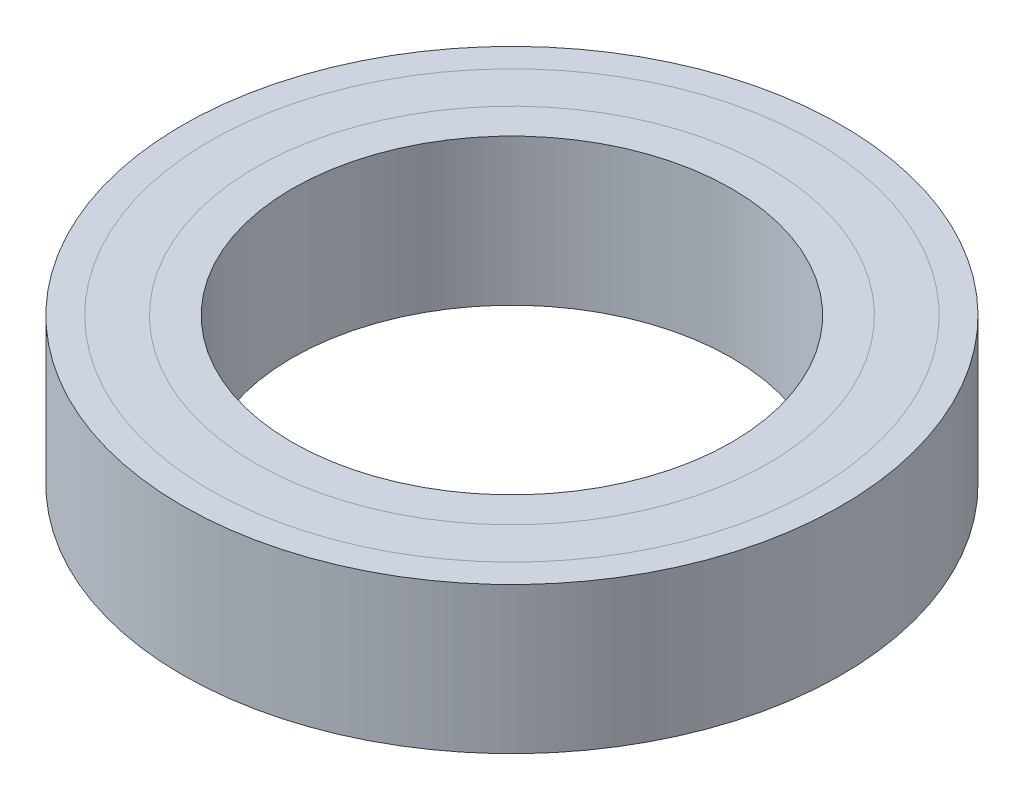
ISO-10303-21;
HEADER;
FILE_DESCRIPTION(('STEP AP214'),'2;1');
FILE_NAME('part.step','',(''),(''),'','','');
FILE_SCHEMA(('AUTOMOTIVE_DESIGN { 1 0 10303 214 1 1 1 1 }'));
ENDSEC;
DATA;
#1=APPLICATION_CONTEXT('core data for automotive mechanical design processes');
#2=APPLICATION_PROTOCOL_DEFINITION('international standard','automotive_design',2000,#1);
#3=PRODUCT_CONTEXT('',#1,'mechanical');
#4=PRODUCT('Part','Part','',(#3));
#5=PRODUCT_RELATED_PRODUCT_CATEGORY('part','',(#4));
#6=PRODUCT_DEFINITION_FORMATION('','',#4);
#7=PRODUCT_DEFINITION_CONTEXT('part definition',#1,'design');
#8=PRODUCT_DEFINITION('design','',#6,#7);
#9=PRODUCT_DEFINITION_SHAPE('','',#8);
#10=(LENGTH_UNIT() NAMED_UNIT(*) SI_UNIT(.MILLI.,.METRE.));
#11=(NAMED_UNIT(*) PLANE_ANGLE_UNIT() SI_UNIT($,.RADIAN.));
#12=(NAMED_UNIT(*) SI_UNIT($,.STERADIAN.) SOLID_ANGLE_UNIT());
#13=UNCERTAINTY_MEASURE_WITH_UNIT(LENGTH_MEASURE(1.E-05),#10,'distance_accuracy_value','');
#14=(GEOMETRIC_REPRESENTATION_CONTEXT(3) GLOBAL_UNCERTAINTY_ASSIGNED_CONTEXT((#13)) GLOBAL_UNIT_ASSIGNED_CONTEXT((#10,
#11,#12)) REPRESENTATION_CONTEXT('',''));
#15=CARTESIAN_POINT('',(0.,0.,0.));
#16=DIRECTION('',(0.,0.,1.));
#17=DIRECTION('',(1.,0.,0.));
#18=AXIS2_PLACEMENT_3D('',#15,#16,#17);
#19=CARTESIAN_POINT('',(0.,-0.00999999999999959,0.));
#20=DIRECTION('',(0.,1.,0.));
#21=DIRECTION('',(0.,0.,1.));
#22=AXIS2_PLACEMENT_3D('',#19,#20,#21);
#23=CYLINDRICAL_SURFACE('',#22,7.);
#24=CARTESIAN_POINT('',(0.,4.,0.));
#25=DIRECTION('',(0.,1.,0.));
#26=DIRECTION('',(0.,0.,1.));
#27=AXIS2_PLACEMENT_3D('',#24,#25,#26);
#28=CIRCLE('',#27,7.);
#29=CARTESIAN_POINT('',(0.,4.,7.));
#30=VERTEX_POINT('',#29);
#31=EDGE_CURVE('E50',#30,#30,#28,.T.);
#32=ORIENTED_EDGE('',*,*,#31,.T.);
#33=EDGE_LOOP('',(#32));
#34=FACE_BOUND('',#33,.T.);
#35=CARTESIAN_POINT('',(0.,0.,0.));
#36=DIRECTION('',(0.,1.,0.));
#37=DIRECTION('',(0.,0.,1.));
#38=AXIS2_PLACEMENT_3D('',#35,#36,#37);
#39=CIRCLE('',#38,7.);
#40=CARTESIAN_POINT('',(0.,0.,7.));
#41=VERTEX_POINT('',#40);
#42=EDGE_CURVE('E56',#41,#41,#39,.T.);
#43=ORIENTED_EDGE('',*,*,#42,.F.);
#44=EDGE_LOOP('',(#43));
#45=FACE_BOUND('',#44,.T.);
#46=ADVANCED_FACE('F43',(#34,#45),#23,.F.);
#47=CARTESIAN_POINT('',(0.,-0.00999999999999959,0.));
#48=DIRECTION('',(0.,1.,0.));
#49=DIRECTION('',(0.,0.,1.));
#50=AXIS2_PLACEMENT_3D('',#47,#48,#49);
#51=CYLINDRICAL_SURFACE('',#50,8.25);
#52=CARTESIAN_POINT('',(0.,0.,0.));
#53=DIRECTION('',(0.,1.,0.));
#54=DIRECTION('',(0.,0.,1.));
#55=AXIS2_PLACEMENT_3D('',#52,#53,#54);
#56=CIRCLE('',#55,8.25);
#57=CARTESIAN_POINT('',(0.,0.,8.25));
#58=VERTEX_POINT('',#57);
#59=EDGE_CURVE('E11',#58,#58,#56,.T.);
#60=ORIENTED_EDGE('',*,*,#59,.T.);
#61=EDGE_LOOP('',(#60));
#62=FACE_BOUND('',#61,.T.);
#63=CARTESIAN_POINT('',(0.,4.,0.));
#64=DIRECTION('',(0.,1.,0.));
#65=DIRECTION('',(0.,0.,1.));
#66=AXIS2_PLACEMENT_3D('',#63,#64,#65);
#67=CIRCLE('',#66,8.25);
#68=CARTESIAN_POINT('',(0.,4.,8.25));
#69=VERTEX_POINT('',#68);
#70=EDGE_CURVE('E46',#69,#69,#67,.T.);
#71=ORIENTED_EDGE('',*,*,#70,.F.);
#72=EDGE_LOOP('',(#71));
#73=FACE_BOUND('',#72,.T.);
#74=ADVANCED_FACE('F65',(#62,#73),#51,.T.);
#75=CARTESIAN_POINT('',(0.,0.,0.));
#76=DIRECTION('',(0.,1.,0.));
#77=DIRECTION('',(0.,0.,1.));
#78=AXIS2_PLACEMENT_3D('',#75,#76,#77);
#79=PLANE('',#78);
#80=ORIENTED_EDGE('',*,*,#42,.T.);
#81=EDGE_LOOP('',(#80));
#82=FACE_BOUND('',#81,.T.);
#83=ORIENTED_EDGE('',*,*,#59,.F.);
#84=EDGE_LOOP('',(#83));
#85=FACE_BOUND('',#84,.T.);
#86=ADVANCED_FACE('F67',(#82,#85),#79,.F.);
#87=CARTESIAN_POINT('',(0.,4.,0.));
#88=DIRECTION('',(0.,1.,0.));
#89=DIRECTION('',(0.,0.,1.));
#90=AXIS2_PLACEMENT_3D('',#87,#88,#89);
#91=PLANE('',#90);
#92=ORIENTED_EDGE('',*,*,#31,.F.);
#93=EDGE_LOOP('',(#92));
#94=FACE_BOUND('',#93,.T.);
#95=ORIENTED_EDGE('',*,*,#70,.T.);
#96=EDGE_LOOP('',(#95));
#97=FACE_BOUND('',#96,.T.);
#98=ADVANCED_FACE('F63',(#94,#97),#91,.T.);
#99=CLOSED_SHELL('',(#46,#74,#86,#98));
#100=MANIFOLD_SOLID_BREP('B2',#99);
#101=CARTESIAN_POINT('',(0.,-0.00999999999999959,0.));
#102=DIRECTION('',(0.,1.,0.));
#103=DIRECTION('',(0.,0.,1.));
#104=AXIS2_PLACEMENT_3D('',#101,#102,#103);
#105=CYLINDRICAL_SURFACE('',#104,7.);
#106=CARTESIAN_POINT('',(0.,0.,0.));
#107=DIRECTION('',(0.,1.,0.));
#108=DIRECTION('',(0.,0.,1.));
#109=AXIS2_PLACEMENT_3D('',#106,#107,#108);
#110=CIRCLE('',#109,7.);
#111=CARTESIAN_POINT('',(0.,0.,7.));
#112=VERTEX_POINT('',#111);
#113=EDGE_CURVE('E115',#112,#112,#110,.T.);
#114=ORIENTED_EDGE('',*,*,#113,.T.);
#115=EDGE_LOOP('',(#114));
#116=FACE_BOUND('',#115,.T.);
#117=CARTESIAN_POINT('',(0.,4.,0.));
#118=DIRECTION('',(0.,1.,0.));
#119=DIRECTION('',(0.,0.,1.));
#120=AXIS2_PLACEMENT_3D('',#117,#118,#119);
#121=CIRCLE('',#120,7.);
#122=CARTESIAN_POINT('',(0.,4.,7.));
#123=VERTEX_POINT('',#122);
#124=EDGE_CURVE('E124',#123,#123,#121,.T.);
#125=ORIENTED_EDGE('',*,*,#124,.F.);
#126=EDGE_LOOP('',(#125));
#127=FACE_BOUND('',#126,.T.);
#128=ADVANCED_FACE('F111',(#116,#127),#105,.T.);
#129=CARTESIAN_POINT('',(0.,4.,0.));
#130=DIRECTION('',(0.,-1.,0.));
#131=DIRECTION('',(0.,0.,-1.));
#132=AXIS2_PLACEMENT_3D('',#129,#130,#131);
#133=CYLINDRICAL_SURFACE('',#132,6.);
#134=CARTESIAN_POINT('',(0.,4.,0.));
#135=DIRECTION('',(0.,1.,0.));
#136=DIRECTION('',(0.,0.,1.));
#137=AXIS2_PLACEMENT_3D('',#134,#135,#136);
#138=CIRCLE('',#137,6.);
#139=CARTESIAN_POINT('',(0.,4.,6.));
#140=VERTEX_POINT('',#139);
#141=EDGE_CURVE('E119',#140,#140,#138,.T.);
#142=ORIENTED_EDGE('',*,*,#141,.T.);
#143=EDGE_LOOP('',(#142));
#144=FACE_BOUND('',#143,.T.);
#145=CARTESIAN_POINT('',(0.,0.,0.));
#146=DIRECTION('',(0.,1.,0.));
#147=DIRECTION('',(0.,0.,1.));
#148=AXIS2_PLACEMENT_3D('',#145,#146,#147);
#149=CIRCLE('',#148,6.);
#150=CARTESIAN_POINT('',(0.,0.,6.));
#151=VERTEX_POINT('',#150);
#152=EDGE_CURVE('E42',#151,#151,#149,.T.);
#153=ORIENTED_EDGE('',*,*,#152,.F.);
#154=EDGE_LOOP('',(#153));
#155=FACE_BOUND('',#154,.T.);
#156=ADVANCED_FACE('F136',(#144,#155),#133,.F.);
#157=CARTESIAN_POINT('',(0.,0.,0.));
#158=DIRECTION('',(0.,1.,0.));
#159=DIRECTION('',(0.,0.,1.));
#160=AXIS2_PLACEMENT_3D('',#157,#158,#159);
#161=PLANE('',#160);
#162=ORIENTED_EDGE('',*,*,#152,.T.);
#163=EDGE_LOOP('',(#162));
#164=FACE_BOUND('',#163,.T.);
#165=ORIENTED_EDGE('',*,*,#113,.F.);
#166=EDGE_LOOP('',(#165));
#167=FACE_BOUND('',#166,.T.);
#168=ADVANCED_FACE('F134',(#164,#167),#161,.F.);
#169=CARTESIAN_POINT('',(0.,4.,0.));
#170=DIRECTION('',(0.,1.,0.));
#171=DIRECTION('',(0.,0.,1.));
#172=AXIS2_PLACEMENT_3D('',#169,#170,#171);
#173=PLANE('',#172);
#174=ORIENTED_EDGE('',*,*,#141,.F.);
#175=EDGE_LOOP('',(#174));
#176=FACE_BOUND('',#175,.T.);
#177=ORIENTED_EDGE('',*,*,#124,.T.);
#178=EDGE_LOOP('',(#177));
#179=FACE_BOUND('',#178,.T.);
#180=ADVANCED_FACE('F113',(#176,#179),#173,.T.);
#181=CLOSED_SHELL('',(#128,#156,#168,#180));
#182=MANIFOLD_SOLID_BREP('B6',#181);
#183=CARTESIAN_POINT('',(0.,-0.00999999999999959,0.));
#184=DIRECTION('',(0.,1.,0.));
#185=DIRECTION('',(0.,0.,1.));
#186=AXIS2_PLACEMENT_3D('',#183,#184,#185);
#187=CYLINDRICAL_SURFACE('',#186,8.25);
#188=CARTESIAN_POINT('',(0.,4.,0.));
#189=DIRECTION('',(0.,1.,0.));
#190=DIRECTION('',(0.,0.,1.));
#191=AXIS2_PLACEMENT_3D('',#188,#189,#190);
#192=CIRCLE('',#191,8.25);
#193=CARTESIAN_POINT('',(0.,4.,8.25));
#194=VERTEX_POINT('',#193);
#195=EDGE_CURVE('E176',#194,#194,#192,.T.);
#196=ORIENTED_EDGE('',*,*,#195,.T.);
#197=EDGE_LOOP('',(#196));
#198=FACE_BOUND('',#197,.T.);
#199=CARTESIAN_POINT('',(0.,0.,0.));
#200=DIRECTION('',(0.,1.,0.));
#201=DIRECTION('',(0.,0.,1.));
#202=AXIS2_PLACEMENT_3D('',#199,#200,#201);
#203=CIRCLE('',#202,8.25);
#204=CARTESIAN_POINT('',(0.,0.,8.25));
#205=VERTEX_POINT('',#204);
#206=EDGE_CURVE('E185',#205,#205,#203,.T.);
#207=ORIENTED_EDGE('',*,*,#206,.F.);
#208=EDGE_LOOP('',(#207));
#209=FACE_BOUND('',#208,.T.);
#210=ADVANCED_FACE('F172',(#198,#209),#187,.F.);
#211=CARTESIAN_POINT('',(0.,4.,0.));
#212=DIRECTION('',(0.,-1.,0.));
#213=DIRECTION('',(0.,0.,-1.));
#214=AXIS2_PLACEMENT_3D('',#211,#212,#213);
#215=CYLINDRICAL_SURFACE('',#214,9.);
#216=CARTESIAN_POINT('',(0.,4.,0.));
#217=DIRECTION('',(0.,1.,0.));
#218=DIRECTION('',(0.,0.,1.));
#219=AXIS2_PLACEMENT_3D('',#216,#217,#218);
#220=CIRCLE('',#219,9.);
#221=CARTESIAN_POINT('',(0.,4.,9.));
#222=VERTEX_POINT('',#221);
#223=EDGE_CURVE('E180',#222,#222,#220,.T.);
#224=ORIENTED_EDGE('',*,*,#223,.F.);
#225=EDGE_LOOP('',(#224));
#226=FACE_BOUND('',#225,.T.);
#227=CARTESIAN_POINT('',(0.,0.,0.));
#228=DIRECTION('',(0.,1.,0.));
#229=DIRECTION('',(0.,0.,1.));
#230=AXIS2_PLACEMENT_3D('',#227,#228,#229);
#231=CIRCLE('',#230,9.);
#232=CARTESIAN_POINT('',(0.,0.,9.));
#233=VERTEX_POINT('',#232);
#234=EDGE_CURVE('E110',#233,#233,#231,.T.);
#235=ORIENTED_EDGE('',*,*,#234,.T.);
#236=EDGE_LOOP('',(#235));
#237=FACE_BOUND('',#236,.T.);
#238=ADVANCED_FACE('F200',(#226,#237),#215,.T.);
#239=CARTESIAN_POINT('',(0.,0.,0.));
#240=DIRECTION('',(0.,1.,0.));
#241=DIRECTION('',(0.,0.,1.));
#242=AXIS2_PLACEMENT_3D('',#239,#240,#241);
#243=PLANE('',#242);
#244=ORIENTED_EDGE('',*,*,#206,.T.);
#245=EDGE_LOOP('',(#244));
#246=FACE_BOUND('',#245,.T.);
#247=ORIENTED_EDGE('',*,*,#234,.F.);
#248=EDGE_LOOP('',(#247));
#249=FACE_BOUND('',#248,.T.);
#250=ADVANCED_FACE('F197',(#246,#249),#243,.F.);
#251=CARTESIAN_POINT('',(0.,4.,0.));
#252=DIRECTION('',(0.,1.,0.));
#253=DIRECTION('',(0.,0.,1.));
#254=AXIS2_PLACEMENT_3D('',#251,#252,#253);
#255=PLANE('',#254);
#256=ORIENTED_EDGE('',*,*,#195,.F.);
#257=EDGE_LOOP('',(#256));
#258=FACE_BOUND('',#257,.T.);
#259=ORIENTED_EDGE('',*,*,#223,.T.);
#260=EDGE_LOOP('',(#259));
#261=FACE_BOUND('',#260,.T.);
#262=ADVANCED_FACE('F174',(#258,#261),#255,.T.);
#263=CLOSED_SHELL('',(#210,#238,#250,#262));
#264=MANIFOLD_SOLID_BREP('B37',#263);
#265=ADVANCED_BREP_SHAPE_REPRESENTATION('',(#18,#100,#182,#264),#14);
#266=SHAPE_DEFINITION_REPRESENTATION(#9,#265);
ENDSEC;
END-ISO-10303-21;
